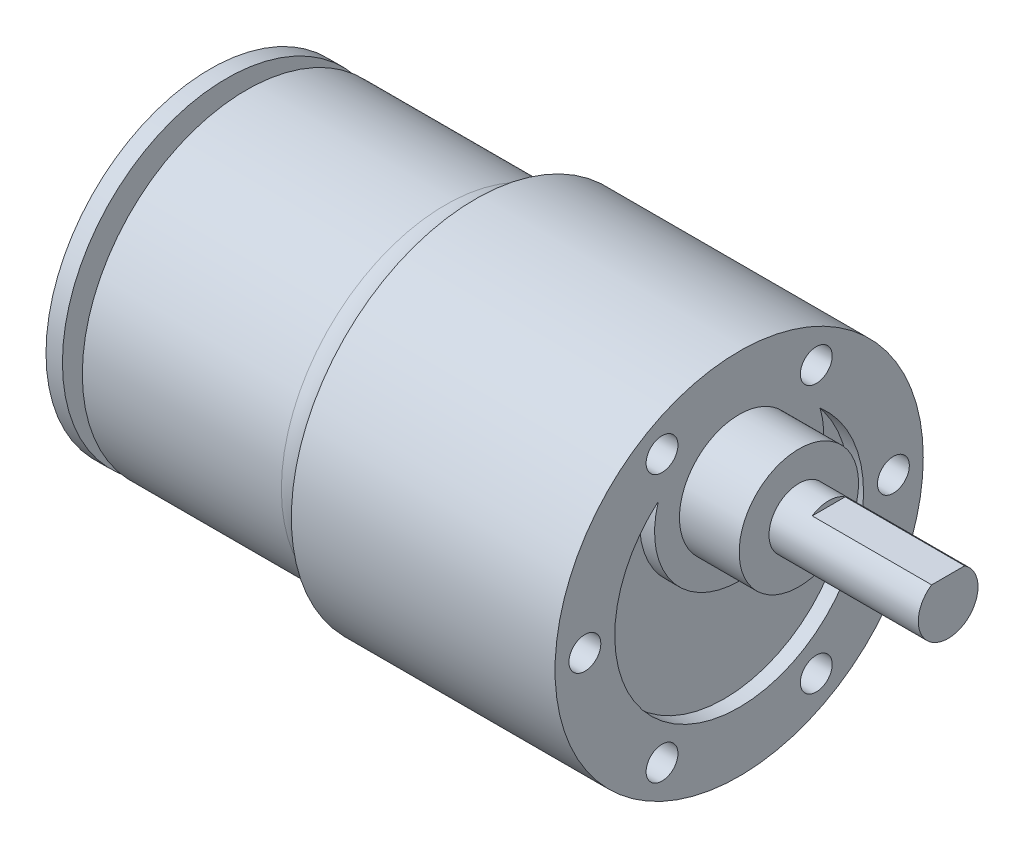
ISO-10303-21;
HEADER;
FILE_DESCRIPTION(('STEP AP214'),'2;1');
FILE_NAME('part.step','',(''),(''),'','','');
FILE_SCHEMA(('AUTOMOTIVE_DESIGN { 1 0 10303 214 1 1 1 1 }'));
ENDSEC;
DATA;
#1=APPLICATION_CONTEXT('core data for automotive mechanical design processes');
#2=APPLICATION_PROTOCOL_DEFINITION('international standard','automotive_design',2000,#1);
#3=PRODUCT_CONTEXT('',#1,'mechanical');
#4=PRODUCT('Part','Part','',(#3));
#5=PRODUCT_RELATED_PRODUCT_CATEGORY('part','',(#4));
#6=PRODUCT_DEFINITION_FORMATION('','',#4);
#7=PRODUCT_DEFINITION_CONTEXT('part definition',#1,'design');
#8=PRODUCT_DEFINITION('design','',#6,#7);
#9=PRODUCT_DEFINITION_SHAPE('','',#8);
#10=(LENGTH_UNIT() NAMED_UNIT(*) SI_UNIT(.MILLI.,.METRE.));
#11=(NAMED_UNIT(*) PLANE_ANGLE_UNIT() SI_UNIT($,.RADIAN.));
#12=(NAMED_UNIT(*) SI_UNIT($,.STERADIAN.) SOLID_ANGLE_UNIT());
#13=UNCERTAINTY_MEASURE_WITH_UNIT(LENGTH_MEASURE(1.E-05),#10,'distance_accuracy_value','');
#14=(GEOMETRIC_REPRESENTATION_CONTEXT(3) GLOBAL_UNCERTAINTY_ASSIGNED_CONTEXT((#13)) GLOBAL_UNIT_ASSIGNED_CONTEXT((#10,
#11,#12)) REPRESENTATION_CONTEXT('',''));
#15=CARTESIAN_POINT('',(0.,0.,0.));
#16=DIRECTION('',(0.,0.,1.));
#17=DIRECTION('',(1.,0.,0.));
#18=AXIS2_PLACEMENT_3D('',#15,#16,#17);
#19=CARTESIAN_POINT('',(49.5,0.,0.));
#20=DIRECTION('',(1.,0.,0.));
#21=DIRECTION('',(0.,0.,-1.));
#22=AXIS2_PLACEMENT_3D('',#19,#20,#21);
#23=PLANE('',#22);
#24=CARTESIAN_POINT('',(49.5,0.,15.5));
#25=DIRECTION('',(1.,0.,0.));
#26=DIRECTION('',(0.,0.,-1.));
#27=AXIS2_PLACEMENT_3D('',#24,#25,#26);
#28=CIRCLE('',#27,1.6);
#29=CARTESIAN_POINT('',(49.5,0.,13.9));
#30=VERTEX_POINT('',#29);
#31=EDGE_CURVE('E500',#30,#30,#28,.T.);
#32=ORIENTED_EDGE('',*,*,#31,.F.);
#33=EDGE_LOOP('',(#32));
#34=FACE_BOUND('',#33,.T.);
#35=CARTESIAN_POINT('',(49.5,-13.4233937586587,7.75000000000016));
#36=DIRECTION('',(1.,0.,0.));
#37=DIRECTION('',(0.,0.,-1.));
#38=AXIS2_PLACEMENT_3D('',#35,#36,#37);
#39=CIRCLE('',#38,1.6);
#40=CARTESIAN_POINT('',(49.5,-13.4233937586587,6.15000000000015));
#41=VERTEX_POINT('',#40);
#42=EDGE_CURVE('E528',#41,#41,#39,.T.);
#43=ORIENTED_EDGE('',*,*,#42,.F.);
#44=EDGE_LOOP('',(#43));
#45=FACE_BOUND('',#44,.T.);
#46=CARTESIAN_POINT('',(49.5,-13.4233937586589,-7.74999999999987));
#47=DIRECTION('',(1.,0.,0.));
#48=DIRECTION('',(0.,0.,-1.));
#49=AXIS2_PLACEMENT_3D('',#46,#47,#48);
#50=CIRCLE('',#49,1.6);
#51=CARTESIAN_POINT('',(49.5,-13.4233937586589,-9.34999999999988));
#52=VERTEX_POINT('',#51);
#53=EDGE_CURVE('E503',#52,#52,#50,.T.);
#54=ORIENTED_EDGE('',*,*,#53,.F.);
#55=EDGE_LOOP('',(#54));
#56=FACE_BOUND('',#55,.T.);
#57=CARTESIAN_POINT('',(49.5,-1.08235921504137E-13,-15.5));
#58=DIRECTION('',(1.,0.,0.));
#59=DIRECTION('',(0.,0.,-1.));
#60=AXIS2_PLACEMENT_3D('',#57,#58,#59);
#61=CIRCLE('',#60,1.6);
#62=CARTESIAN_POINT('',(49.5,-1.08235921504137E-13,-17.1));
#63=VERTEX_POINT('',#62);
#64=EDGE_CURVE('E510',#63,#63,#61,.T.);
#65=ORIENTED_EDGE('',*,*,#64,.F.);
#66=EDGE_LOOP('',(#65));
#67=FACE_BOUND('',#66,.T.);
#68=CARTESIAN_POINT('',(49.5,13.4233937586588,-7.75000000000006));
#69=DIRECTION('',(1.,0.,0.));
#70=DIRECTION('',(0.,0.,-1.));
#71=AXIS2_PLACEMENT_3D('',#68,#69,#70);
#72=CIRCLE('',#71,1.6);
#73=CARTESIAN_POINT('',(49.5,13.4233937586588,-9.35000000000006));
#74=VERTEX_POINT('',#73);
#75=EDGE_CURVE('E516',#74,#74,#72,.T.);
#76=ORIENTED_EDGE('',*,*,#75,.F.);
#77=EDGE_LOOP('',(#76));
#78=FACE_BOUND('',#77,.T.);
#79=CARTESIAN_POINT('',(49.5,13.4233937586588,7.74999999999997));
#80=DIRECTION('',(1.,0.,0.));
#81=DIRECTION('',(0.,0.,-1.));
#82=AXIS2_PLACEMENT_3D('',#79,#80,#81);
#83=CIRCLE('',#82,1.6);
#84=CARTESIAN_POINT('',(49.5,13.4233937586588,6.14999999999997));
#85=VERTEX_POINT('',#84);
#86=EDGE_CURVE('E522',#85,#85,#83,.T.);
#87=ORIENTED_EDGE('',*,*,#86,.F.);
#88=EDGE_LOOP('',(#87));
#89=FACE_BOUND('',#88,.T.);
#90=CARTESIAN_POINT('',(49.5,7.,0.));
#91=DIRECTION('',(1.,0.,0.));
#92=DIRECTION('',(0.,0.,-1.));
#93=AXIS2_PLACEMENT_3D('',#90,#91,#92);
#94=CIRCLE('',#93,6.);
#95=CARTESIAN_POINT('',(49.5,7.,-6.));
#96=VERTEX_POINT('',#95);
#97=EDGE_CURVE('E116',#96,#96,#94,.T.);
#98=ORIENTED_EDGE('',*,*,#97,.F.);
#99=EDGE_LOOP('',(#98));
#100=FACE_BOUND('',#99,.T.);
#101=CARTESIAN_POINT('',(49.5,0.,0.));
#102=DIRECTION('',(1.,0.,0.));
#103=DIRECTION('',(0.,0.,-1.));
#104=AXIS2_PLACEMENT_3D('',#101,#102,#103);
#105=CIRCLE('',#104,18.5);
#106=CARTESIAN_POINT('',(49.5,0.,-18.5));
#107=VERTEX_POINT('',#106);
#108=EDGE_CURVE('E124',#107,#107,#105,.T.);
#109=ORIENTED_EDGE('',*,*,#108,.T.);
#110=EDGE_LOOP('',(#109));
#111=FACE_BOUND('',#110,.T.);
#112=CARTESIAN_POINT('',(49.5,0.,0.));
#113=DIRECTION('',(1.,0.,0.));
#114=DIRECTION('',(0.,0.,-1.));
#115=AXIS2_PLACEMENT_3D('',#112,#113,#114);
#116=CIRCLE('',#115,12.5);
#117=CARTESIAN_POINT('',(49.5,9.5,8.12403840463596));
#118=VERTEX_POINT('',#117);
#119=CARTESIAN_POINT('',(49.5,9.5,-8.12403840463596));
#120=VERTEX_POINT('',#119);
#121=EDGE_CURVE('E107',#118,#120,#116,.T.);
#122=ORIENTED_EDGE('',*,*,#121,.F.);
#123=CARTESIAN_POINT('',(49.5,7.,0.));
#124=DIRECTION('',(1.,0.,0.));
#125=DIRECTION('',(0.,0.,-1.));
#126=AXIS2_PLACEMENT_3D('',#123,#124,#125);
#127=CIRCLE('',#126,8.5);
#128=EDGE_CURVE('E63',#118,#120,#127,.T.);
#129=ORIENTED_EDGE('',*,*,#128,.T.);
#130=EDGE_LOOP('',(#122,#129));
#131=FACE_BOUND('',#130,.T.);
#132=ADVANCED_FACE('F38',(#34,#45,#56,#67,#78,#89,#100,#111,#131),#23,.T.);
#133=CARTESIAN_POINT('',(23.,0.,0.));
#134=DIRECTION('',(-1.,0.,0.));
#135=DIRECTION('',(0.,0.,1.));
#136=AXIS2_PLACEMENT_3D('',#133,#134,#135);
#137=CYLINDRICAL_SURFACE('',#136,16.5);
#138=CARTESIAN_POINT('',(20.,0.,0.));
#139=DIRECTION('',(1.,0.,0.));
#140=DIRECTION('',(0.,0.,-1.));
#141=AXIS2_PLACEMENT_3D('',#138,#139,#140);
#142=CIRCLE('',#141,16.5);
#143=CARTESIAN_POINT('',(20.,0.,-16.5));
#144=VERTEX_POINT('',#143);
#145=EDGE_CURVE('E42',#144,#144,#142,.F.);
#146=ORIENTED_EDGE('',*,*,#145,.T.);
#147=EDGE_LOOP('',(#146));
#148=FACE_BOUND('',#147,.T.);
#149=CARTESIAN_POINT('',(0.,0.,0.));
#150=DIRECTION('',(1.,0.,0.));
#151=DIRECTION('',(0.,0.,-1.));
#152=AXIS2_PLACEMENT_3D('',#149,#150,#151);
#153=CIRCLE('',#152,16.5);
#154=CARTESIAN_POINT('',(0.,0.,-16.5));
#155=VERTEX_POINT('',#154);
#156=EDGE_CURVE('E127',#155,#155,#153,.T.);
#157=ORIENTED_EDGE('',*,*,#156,.T.);
#158=EDGE_LOOP('',(#157));
#159=FACE_BOUND('',#158,.T.);
#160=ADVANCED_FACE('F138',(#148,#159),#137,.T.);
#161=CARTESIAN_POINT('',(0.,0.,0.));
#162=DIRECTION('',(1.,0.,0.));
#163=DIRECTION('',(0.,0.,-1.));
#164=AXIS2_PLACEMENT_3D('',#161,#162,#163);
#165=PLANE('',#164);
#166=CARTESIAN_POINT('',(0.,0.,0.));
#167=DIRECTION('',(-1.,0.,0.));
#168=DIRECTION('',(0.,0.,1.));
#169=AXIS2_PLACEMENT_3D('',#166,#167,#168);
#170=CIRCLE('',#169,4.);
#171=CARTESIAN_POINT('',(0.,0.,4.));
#172=VERTEX_POINT('',#171);
#173=EDGE_CURVE('E11',#172,#172,#170,.T.);
#174=ORIENTED_EDGE('',*,*,#173,.F.);
#175=EDGE_LOOP('',(#174));
#176=FACE_BOUND('',#175,.T.);
#177=ORIENTED_EDGE('',*,*,#156,.F.);
#178=EDGE_LOOP('',(#177));
#179=FACE_BOUND('',#178,.T.);
#180=ADVANCED_FACE('F144',(#176,#179),#165,.F.);
#181=CARTESIAN_POINT('',(20.,0.,0.));
#182=DIRECTION('',(1.,0.,0.));
#183=DIRECTION('',(0.,0.,-1.));
#184=AXIS2_PLACEMENT_3D('',#181,#182,#183);
#185=TOROIDAL_SURFACE('',#184,13.5,3.);
#186=ORIENTED_EDGE('',*,*,#145,.F.);
#187=EDGE_LOOP('',(#186));
#188=FACE_BOUND('',#187,.T.);
#189=CARTESIAN_POINT('',(23.,0.,0.));
#190=DIRECTION('',(1.,0.,0.));
#191=DIRECTION('',(0.,0.,-1.));
#192=AXIS2_PLACEMENT_3D('',#189,#190,#191);
#193=CIRCLE('',#192,13.5);
#194=CARTESIAN_POINT('',(23.,0.,-13.5));
#195=VERTEX_POINT('',#194);
#196=EDGE_CURVE('E131',#195,#195,#193,.T.);
#197=ORIENTED_EDGE('',*,*,#196,.F.);
#198=EDGE_LOOP('',(#197));
#199=FACE_BOUND('',#198,.T.);
#200=ADVANCED_FACE('F40',(#188,#199),#185,.T.);
#201=CARTESIAN_POINT('',(49.5,0.,0.));
#202=DIRECTION('',(-1.,0.,0.));
#203=DIRECTION('',(0.,0.,1.));
#204=AXIS2_PLACEMENT_3D('',#201,#202,#203);
#205=CYLINDRICAL_SURFACE('',#204,18.5);
#206=ORIENTED_EDGE('',*,*,#108,.F.);
#207=EDGE_LOOP('',(#206));
#208=FACE_BOUND('',#207,.T.);
#209=CARTESIAN_POINT('',(23.,0.,0.));
#210=DIRECTION('',(1.,0.,0.));
#211=DIRECTION('',(0.,0.,-1.));
#212=AXIS2_PLACEMENT_3D('',#209,#210,#211);
#213=CIRCLE('',#212,18.5);
#214=CARTESIAN_POINT('',(23.,0.,-18.5));
#215=VERTEX_POINT('',#214);
#216=EDGE_CURVE('E121',#215,#215,#213,.T.);
#217=ORIENTED_EDGE('',*,*,#216,.T.);
#218=EDGE_LOOP('',(#217));
#219=FACE_BOUND('',#218,.T.);
#220=ADVANCED_FACE('F143',(#208,#219),#205,.T.);
#221=CARTESIAN_POINT('',(23.,0.,0.));
#222=DIRECTION('',(1.,0.,0.));
#223=DIRECTION('',(0.,0.,-1.));
#224=AXIS2_PLACEMENT_3D('',#221,#222,#223);
#225=PLANE('',#224);
#226=ORIENTED_EDGE('',*,*,#196,.T.);
#227=EDGE_LOOP('',(#226));
#228=FACE_BOUND('',#227,.T.);
#229=ORIENTED_EDGE('',*,*,#216,.F.);
#230=EDGE_LOOP('',(#229));
#231=FACE_BOUND('',#230,.T.);
#232=ADVANCED_FACE('F149',(#228,#231),#225,.F.);
#233=CARTESIAN_POINT('',(55.5,7.,0.));
#234=DIRECTION('',(-1.,0.,0.));
#235=DIRECTION('',(0.,0.,1.));
#236=AXIS2_PLACEMENT_3D('',#233,#234,#235);
#237=CYLINDRICAL_SURFACE('',#236,6.);
#238=CARTESIAN_POINT('',(55.5,7.,0.));
#239=DIRECTION('',(1.,0.,0.));
#240=DIRECTION('',(0.,0.,-1.));
#241=AXIS2_PLACEMENT_3D('',#238,#239,#240);
#242=CIRCLE('',#241,6.);
#243=CARTESIAN_POINT('',(55.5,7.,-6.));
#244=VERTEX_POINT('',#243);
#245=EDGE_CURVE('E118',#244,#244,#242,.T.);
#246=ORIENTED_EDGE('',*,*,#245,.F.);
#247=EDGE_LOOP('',(#246));
#248=FACE_BOUND('',#247,.T.);
#249=ORIENTED_EDGE('',*,*,#97,.T.);
#250=EDGE_LOOP('',(#249));
#251=FACE_BOUND('',#250,.T.);
#252=ADVANCED_FACE('F164',(#248,#251),#237,.T.);
#253=CARTESIAN_POINT('',(55.5,7.,0.));
#254=DIRECTION('',(1.,0.,0.));
#255=DIRECTION('',(0.,0.,-1.));
#256=AXIS2_PLACEMENT_3D('',#253,#254,#255);
#257=PLANE('',#256);
#258=CARTESIAN_POINT('',(55.5,7.,0.));
#259=DIRECTION('',(1.,0.,0.));
#260=DIRECTION('',(0.,0.,-1.));
#261=AXIS2_PLACEMENT_3D('',#258,#259,#260);
#262=CIRCLE('',#261,3.);
#263=CARTESIAN_POINT('',(55.5,7.,-3.));
#264=VERTEX_POINT('',#263);
#265=EDGE_CURVE('E47',#264,#264,#262,.T.);
#266=ORIENTED_EDGE('',*,*,#265,.F.);
#267=EDGE_LOOP('',(#266));
#268=FACE_BOUND('',#267,.T.);
#269=ORIENTED_EDGE('',*,*,#245,.T.);
#270=EDGE_LOOP('',(#269));
#271=FACE_BOUND('',#270,.T.);
#272=ADVANCED_FACE('F170',(#268,#271),#257,.T.);
#273=CARTESIAN_POINT('',(48.,7.,0.));
#274=DIRECTION('',(1.,0.,0.));
#275=DIRECTION('',(0.,0.,-1.));
#276=AXIS2_PLACEMENT_3D('',#273,#274,#275);
#277=CYLINDRICAL_SURFACE('',#276,8.5);
#278=ORIENTED_EDGE('',*,*,#128,.F.);
#279=DIRECTION('',(1.,0.,0.));
#280=VECTOR('',#279,1.);
#281=CARTESIAN_POINT('',(48.,9.5,8.12403840463596));
#282=LINE('',#281,#280);
#283=CARTESIAN_POINT('',(48.,9.5,8.12403840463596));
#284=VERTEX_POINT('',#283);
#285=EDGE_CURVE('E110',#284,#118,#282,.T.);
#286=ORIENTED_EDGE('',*,*,#285,.F.);
#287=CARTESIAN_POINT('',(48.,7.,0.));
#288=DIRECTION('',(1.,0.,0.));
#289=DIRECTION('',(0.,0.,-1.));
#290=AXIS2_PLACEMENT_3D('',#287,#288,#289);
#291=CIRCLE('',#290,8.5);
#292=CARTESIAN_POINT('',(48.,9.5,-8.12403840463596));
#293=VERTEX_POINT('',#292);
#294=EDGE_CURVE('E104',#284,#293,#291,.T.);
#295=ORIENTED_EDGE('',*,*,#294,.T.);
#296=DIRECTION('',(1.,0.,0.));
#297=VECTOR('',#296,1.);
#298=CARTESIAN_POINT('',(48.,9.5,-8.12403840463596));
#299=LINE('',#298,#297);
#300=EDGE_CURVE('E114',#293,#120,#299,.T.);
#301=ORIENTED_EDGE('',*,*,#300,.T.);
#302=EDGE_LOOP('',(#278,#286,#295,#301));
#303=FACE_BOUND('',#302,.T.);
#304=ADVANCED_FACE('F178',(#303),#277,.T.);
#305=CARTESIAN_POINT('',(48.,0.,0.));
#306=DIRECTION('',(1.,0.,0.));
#307=DIRECTION('',(0.,0.,-1.));
#308=AXIS2_PLACEMENT_3D('',#305,#306,#307);
#309=CYLINDRICAL_SURFACE('',#308,12.5);
#310=ORIENTED_EDGE('',*,*,#121,.T.);
#311=ORIENTED_EDGE('',*,*,#300,.F.);
#312=CARTESIAN_POINT('',(48.,0.,0.));
#313=DIRECTION('',(1.,0.,0.));
#314=DIRECTION('',(0.,0.,-1.));
#315=AXIS2_PLACEMENT_3D('',#312,#313,#314);
#316=CIRCLE('',#315,12.5);
#317=EDGE_CURVE('E106',#284,#293,#316,.T.);
#318=ORIENTED_EDGE('',*,*,#317,.F.);
#319=ORIENTED_EDGE('',*,*,#285,.T.);
#320=EDGE_LOOP('',(#310,#311,#318,#319));
#321=FACE_BOUND('',#320,.T.);
#322=ADVANCED_FACE('F190',(#321),#309,.F.);
#323=CARTESIAN_POINT('',(48.,0.,0.));
#324=DIRECTION('',(1.,0.,0.));
#325=DIRECTION('',(0.,0.,-1.));
#326=AXIS2_PLACEMENT_3D('',#323,#324,#325);
#327=PLANE('',#326);
#328=ORIENTED_EDGE('',*,*,#294,.F.);
#329=ORIENTED_EDGE('',*,*,#317,.T.);
#330=EDGE_LOOP('',(#328,#329));
#331=FACE_BOUND('',#330,.T.);
#332=ADVANCED_FACE('F194',(#331),#327,.T.);
#333=CARTESIAN_POINT('',(70.5,7.,0.));
#334=DIRECTION('',(-1.,0.,0.));
#335=DIRECTION('',(0.,0.,1.));
#336=AXIS2_PLACEMENT_3D('',#333,#334,#335);
#337=CYLINDRICAL_SURFACE('',#336,3.);
#338=CARTESIAN_POINT('',(70.5,7.,0.));
#339=DIRECTION('',(1.,0.,0.));
#340=DIRECTION('',(0.,0.,-1.));
#341=AXIS2_PLACEMENT_3D('',#338,#339,#340);
#342=CIRCLE('',#341,3.);
#343=CARTESIAN_POINT('',(70.5,9.5,1.6583123951777));
#344=VERTEX_POINT('',#343);
#345=CARTESIAN_POINT('',(70.5,9.5,-1.6583123951777));
#346=VERTEX_POINT('',#345);
#347=EDGE_CURVE('E96',#344,#346,#342,.T.);
#348=ORIENTED_EDGE('',*,*,#347,.F.);
#349=DIRECTION('',(1.,0.,0.));
#350=VECTOR('',#349,1.);
#351=CARTESIAN_POINT('',(58.5,9.5,1.6583123951777));
#352=LINE('',#351,#350);
#353=CARTESIAN_POINT('',(58.5,9.5,1.6583123951777));
#354=VERTEX_POINT('',#353);
#355=EDGE_CURVE('E55',#354,#344,#352,.T.);
#356=ORIENTED_EDGE('',*,*,#355,.F.);
#357=CARTESIAN_POINT('',(58.5,7.,0.));
#358=DIRECTION('',(1.,0.,0.));
#359=DIRECTION('',(0.,0.,-1.));
#360=AXIS2_PLACEMENT_3D('',#357,#358,#359);
#361=CIRCLE('',#360,3.);
#362=CARTESIAN_POINT('',(58.5,9.5,-1.6583123951777));
#363=VERTEX_POINT('',#362);
#364=EDGE_CURVE('E82',#363,#354,#361,.T.);
#365=ORIENTED_EDGE('',*,*,#364,.F.);
#366=DIRECTION('',(1.,0.,0.));
#367=VECTOR('',#366,1.);
#368=CARTESIAN_POINT('',(58.5,9.5,-1.6583123951777));
#369=LINE('',#368,#367);
#370=EDGE_CURVE('E90',#363,#346,#369,.T.);
#371=ORIENTED_EDGE('',*,*,#370,.T.);
#372=EDGE_LOOP('',(#348,#356,#365,#371));
#373=FACE_BOUND('',#372,.T.);
#374=ORIENTED_EDGE('',*,*,#265,.T.);
#375=EDGE_LOOP('',(#374));
#376=FACE_BOUND('',#375,.T.);
#377=ADVANCED_FACE('F93',(#373,#376),#337,.T.);
#378=CARTESIAN_POINT('',(70.5,7.,0.));
#379=DIRECTION('',(1.,0.,0.));
#380=DIRECTION('',(0.,0.,-1.));
#381=AXIS2_PLACEMENT_3D('',#378,#379,#380);
#382=PLANE('',#381);
#383=DIRECTION('',(0.,0.,-1.));
#384=VECTOR('',#383,1.);
#385=CARTESIAN_POINT('',(70.5,9.5,1.6583123951777));
#386=LINE('',#385,#384);
#387=EDGE_CURVE('E87',#344,#346,#386,.T.);
#388=ORIENTED_EDGE('',*,*,#387,.F.);
#389=ORIENTED_EDGE('',*,*,#347,.T.);
#390=EDGE_LOOP('',(#388,#389));
#391=FACE_BOUND('',#390,.T.);
#392=ADVANCED_FACE('F201',(#391),#382,.T.);
#393=CARTESIAN_POINT('',(58.5,9.5,1.6583123951777));
#394=DIRECTION('',(0.,-1.,0.));
#395=DIRECTION('',(0.,0.,-1.));
#396=AXIS2_PLACEMENT_3D('',#393,#394,#395);
#397=PLANE('',#396);
#398=ORIENTED_EDGE('',*,*,#387,.T.);
#399=ORIENTED_EDGE('',*,*,#370,.F.);
#400=DIRECTION('',(0.,0.,-1.));
#401=VECTOR('',#400,1.);
#402=CARTESIAN_POINT('',(58.5,9.5,1.6583123951777));
#403=LINE('',#402,#401);
#404=EDGE_CURVE('E84',#354,#363,#403,.T.);
#405=ORIENTED_EDGE('',*,*,#404,.F.);
#406=ORIENTED_EDGE('',*,*,#355,.T.);
#407=EDGE_LOOP('',(#398,#399,#405,#406));
#408=FACE_BOUND('',#407,.T.);
#409=ADVANCED_FACE('F89',(#408),#397,.F.);
#410=CARTESIAN_POINT('',(58.5,7.,0.));
#411=DIRECTION('',(1.,0.,0.));
#412=DIRECTION('',(0.,0.,-1.));
#413=AXIS2_PLACEMENT_3D('',#410,#411,#412);
#414=PLANE('',#413);
#415=ORIENTED_EDGE('',*,*,#364,.T.);
#416=ORIENTED_EDGE('',*,*,#404,.T.);
#417=EDGE_LOOP('',(#415,#416));
#418=FACE_BOUND('',#417,.T.);
#419=ADVANCED_FACE('F83',(#418),#414,.T.);
#420=CARTESIAN_POINT('',(46.5,13.4233937586588,7.74999999999997));
#421=DIRECTION('',(1.,0.,0.));
#422=DIRECTION('',(0.,0.,-1.));
#423=AXIS2_PLACEMENT_3D('',#420,#421,#422);
#424=CYLINDRICAL_SURFACE('',#423,1.6);
#425=CARTESIAN_POINT('',(46.5,13.4233937586588,7.74999999999997));
#426=DIRECTION('',(1.,0.,0.));
#427=DIRECTION('',(0.,0.,-1.));
#428=AXIS2_PLACEMENT_3D('',#425,#426,#427);
#429=CIRCLE('',#428,1.6);
#430=CARTESIAN_POINT('',(46.5,13.4233937586588,6.14999999999997));
#431=VERTEX_POINT('',#430);
#432=EDGE_CURVE('E525',#431,#431,#429,.T.);
#433=ORIENTED_EDGE('',*,*,#432,.F.);
#434=EDGE_LOOP('',(#433));
#435=FACE_BOUND('',#434,.T.);
#436=ORIENTED_EDGE('',*,*,#86,.T.);
#437=EDGE_LOOP('',(#436));
#438=FACE_BOUND('',#437,.T.);
#439=ADVANCED_FACE('F235',(#435,#438),#424,.F.);
#440=CARTESIAN_POINT('',(46.5,13.4233937586588,7.74999999999997));
#441=DIRECTION('',(1.,0.,0.));
#442=DIRECTION('',(0.,0.,-1.));
#443=AXIS2_PLACEMENT_3D('',#440,#441,#442);
#444=PLANE('',#443);
#445=ORIENTED_EDGE('',*,*,#432,.T.);
#446=EDGE_LOOP('',(#445));
#447=FACE_BOUND('',#446,.T.);
#448=ADVANCED_FACE('F242',(#447),#444,.T.);
#449=CARTESIAN_POINT('',(46.5,13.4233937586588,-7.75000000000006));
#450=DIRECTION('',(1.,0.,0.));
#451=DIRECTION('',(0.,0.,-1.));
#452=AXIS2_PLACEMENT_3D('',#449,#450,#451);
#453=CYLINDRICAL_SURFACE('',#452,1.6);
#454=CARTESIAN_POINT('',(46.5,13.4233937586588,-7.75000000000006));
#455=DIRECTION('',(1.,0.,0.));
#456=DIRECTION('',(0.,0.,-1.));
#457=AXIS2_PLACEMENT_3D('',#454,#455,#456);
#458=CIRCLE('',#457,1.6);
#459=CARTESIAN_POINT('',(46.5,13.4233937586588,-9.35000000000006));
#460=VERTEX_POINT('',#459);
#461=EDGE_CURVE('E519',#460,#460,#458,.T.);
#462=ORIENTED_EDGE('',*,*,#461,.F.);
#463=EDGE_LOOP('',(#462));
#464=FACE_BOUND('',#463,.T.);
#465=ORIENTED_EDGE('',*,*,#75,.T.);
#466=EDGE_LOOP('',(#465));
#467=FACE_BOUND('',#466,.T.);
#468=ADVANCED_FACE('F250',(#464,#467),#453,.F.);
#469=CARTESIAN_POINT('',(46.5,13.4233937586588,-7.75000000000006));
#470=DIRECTION('',(1.,0.,0.));
#471=DIRECTION('',(0.,0.,-1.));
#472=AXIS2_PLACEMENT_3D('',#469,#470,#471);
#473=PLANE('',#472);
#474=ORIENTED_EDGE('',*,*,#461,.T.);
#475=EDGE_LOOP('',(#474));
#476=FACE_BOUND('',#475,.T.);
#477=ADVANCED_FACE('F258',(#476),#473,.T.);
#478=CARTESIAN_POINT('',(46.5,-1.08235921504137E-13,-15.5));
#479=DIRECTION('',(1.,0.,0.));
#480=DIRECTION('',(0.,0.,-1.));
#481=AXIS2_PLACEMENT_3D('',#478,#479,#480);
#482=CYLINDRICAL_SURFACE('',#481,1.6);
#483=CARTESIAN_POINT('',(46.5,-1.08235921504137E-13,-15.5));
#484=DIRECTION('',(1.,0.,0.));
#485=DIRECTION('',(0.,0.,-1.));
#486=AXIS2_PLACEMENT_3D('',#483,#484,#485);
#487=CIRCLE('',#486,1.6);
#488=CARTESIAN_POINT('',(46.5,-1.08235921504137E-13,-17.1));
#489=VERTEX_POINT('',#488);
#490=EDGE_CURVE('E513',#489,#489,#487,.T.);
#491=ORIENTED_EDGE('',*,*,#490,.F.);
#492=EDGE_LOOP('',(#491));
#493=FACE_BOUND('',#492,.T.);
#494=ORIENTED_EDGE('',*,*,#64,.T.);
#495=EDGE_LOOP('',(#494));
#496=FACE_BOUND('',#495,.T.);
#497=ADVANCED_FACE('F266',(#493,#496),#482,.F.);
#498=CARTESIAN_POINT('',(46.5,-1.08235921504137E-13,-15.5));
#499=DIRECTION('',(1.,0.,0.));
#500=DIRECTION('',(0.,0.,-1.));
#501=AXIS2_PLACEMENT_3D('',#498,#499,#500);
#502=PLANE('',#501);
#503=ORIENTED_EDGE('',*,*,#490,.T.);
#504=EDGE_LOOP('',(#503));
#505=FACE_BOUND('',#504,.T.);
#506=ADVANCED_FACE('F274',(#505),#502,.T.);
#507=CARTESIAN_POINT('',(46.5,-13.4233937586589,-7.74999999999987));
#508=DIRECTION('',(1.,0.,0.));
#509=DIRECTION('',(0.,0.,-1.));
#510=AXIS2_PLACEMENT_3D('',#507,#508,#509);
#511=CYLINDRICAL_SURFACE('',#510,1.6);
#512=CARTESIAN_POINT('',(46.5,-13.4233937586589,-7.74999999999987));
#513=DIRECTION('',(1.,0.,0.));
#514=DIRECTION('',(0.,0.,-1.));
#515=AXIS2_PLACEMENT_3D('',#512,#513,#514);
#516=CIRCLE('',#515,1.6);
#517=CARTESIAN_POINT('',(46.5,-13.4233937586589,-9.34999999999988));
#518=VERTEX_POINT('',#517);
#519=EDGE_CURVE('E506',#518,#518,#516,.T.);
#520=ORIENTED_EDGE('',*,*,#519,.F.);
#521=EDGE_LOOP('',(#520));
#522=FACE_BOUND('',#521,.T.);
#523=ORIENTED_EDGE('',*,*,#53,.T.);
#524=EDGE_LOOP('',(#523));
#525=FACE_BOUND('',#524,.T.);
#526=ADVANCED_FACE('F282',(#522,#525),#511,.F.);
#527=CARTESIAN_POINT('',(46.5,-13.4233937586589,-7.74999999999987));
#528=DIRECTION('',(1.,0.,0.));
#529=DIRECTION('',(0.,0.,-1.));
#530=AXIS2_PLACEMENT_3D('',#527,#528,#529);
#531=PLANE('',#530);
#532=ORIENTED_EDGE('',*,*,#519,.T.);
#533=EDGE_LOOP('',(#532));
#534=FACE_BOUND('',#533,.T.);
#535=ADVANCED_FACE('F290',(#534),#531,.T.);
#536=CARTESIAN_POINT('',(46.5,-13.4233937586587,7.75000000000016));
#537=DIRECTION('',(1.,0.,0.));
#538=DIRECTION('',(0.,0.,-1.));
#539=AXIS2_PLACEMENT_3D('',#536,#537,#538);
#540=CYLINDRICAL_SURFACE('',#539,1.6);
#541=CARTESIAN_POINT('',(46.5,-13.4233937586587,7.75000000000016));
#542=DIRECTION('',(1.,0.,0.));
#543=DIRECTION('',(0.,0.,-1.));
#544=AXIS2_PLACEMENT_3D('',#541,#542,#543);
#545=CIRCLE('',#544,1.6);
#546=CARTESIAN_POINT('',(46.5,-13.4233937586587,6.15000000000015));
#547=VERTEX_POINT('',#546);
#548=EDGE_CURVE('E507',#547,#547,#545,.T.);
#549=ORIENTED_EDGE('',*,*,#548,.F.);
#550=EDGE_LOOP('',(#549));
#551=FACE_BOUND('',#550,.T.);
#552=ORIENTED_EDGE('',*,*,#42,.T.);
#553=EDGE_LOOP('',(#552));
#554=FACE_BOUND('',#553,.T.);
#555=ADVANCED_FACE('F298',(#551,#554),#540,.F.);
#556=CARTESIAN_POINT('',(46.5,-13.4233937586587,7.75000000000016));
#557=DIRECTION('',(1.,0.,0.));
#558=DIRECTION('',(0.,0.,-1.));
#559=AXIS2_PLACEMENT_3D('',#556,#557,#558);
#560=PLANE('',#559);
#561=ORIENTED_EDGE('',*,*,#548,.T.);
#562=EDGE_LOOP('',(#561));
#563=FACE_BOUND('',#562,.T.);
#564=ADVANCED_FACE('F306',(#563),#560,.T.);
#565=CARTESIAN_POINT('',(46.5,0.,15.5));
#566=DIRECTION('',(1.,0.,0.));
#567=DIRECTION('',(0.,0.,-1.));
#568=AXIS2_PLACEMENT_3D('',#565,#566,#567);
#569=CYLINDRICAL_SURFACE('',#568,1.6);
#570=CARTESIAN_POINT('',(46.5,0.,15.5));
#571=DIRECTION('',(1.,0.,0.));
#572=DIRECTION('',(0.,0.,-1.));
#573=AXIS2_PLACEMENT_3D('',#570,#571,#572);
#574=CIRCLE('',#573,1.6);
#575=CARTESIAN_POINT('',(46.5,0.,13.9));
#576=VERTEX_POINT('',#575);
#577=EDGE_CURVE('E498',#576,#576,#574,.T.);
#578=ORIENTED_EDGE('',*,*,#577,.F.);
#579=EDGE_LOOP('',(#578));
#580=FACE_BOUND('',#579,.T.);
#581=ORIENTED_EDGE('',*,*,#31,.T.);
#582=EDGE_LOOP('',(#581));
#583=FACE_BOUND('',#582,.T.);
#584=ADVANCED_FACE('F314',(#580,#583),#569,.F.);
#585=CARTESIAN_POINT('',(46.5,0.,15.5));
#586=DIRECTION('',(1.,0.,0.));
#587=DIRECTION('',(0.,0.,-1.));
#588=AXIS2_PLACEMENT_3D('',#585,#586,#587);
#589=PLANE('',#588);
#590=ORIENTED_EDGE('',*,*,#577,.T.);
#591=EDGE_LOOP('',(#590));
#592=FACE_BOUND('',#591,.T.);
#593=ADVANCED_FACE('F322',(#592),#589,.T.);
#594=CARTESIAN_POINT('',(-2.,0.,0.));
#595=DIRECTION('',(1.,0.,0.));
#596=DIRECTION('',(0.,0.,-1.));
#597=AXIS2_PLACEMENT_3D('',#594,#595,#596);
#598=CYLINDRICAL_SURFACE('',#597,4.);
#599=CARTESIAN_POINT('',(-2.,0.,0.));
#600=DIRECTION('',(-1.,0.,0.));
#601=DIRECTION('',(0.,0.,1.));
#602=AXIS2_PLACEMENT_3D('',#599,#600,#601);
#603=CIRCLE('',#602,4.);
#604=CARTESIAN_POINT('',(-2.,0.,4.));
#605=VERTEX_POINT('',#604);
#606=EDGE_CURVE('E531',#605,#605,#603,.T.);
#607=ORIENTED_EDGE('',*,*,#606,.F.);
#608=EDGE_LOOP('',(#607));
#609=FACE_BOUND('',#608,.T.);
#610=ORIENTED_EDGE('',*,*,#173,.T.);
#611=EDGE_LOOP('',(#610));
#612=FACE_BOUND('',#611,.T.);
#613=ADVANCED_FACE('F330',(#609,#612),#598,.T.);
#614=CARTESIAN_POINT('',(-3.65,0.,0.));
#615=DIRECTION('',(1.,0.,0.));
#616=DIRECTION('',(0.,0.,-1.));
#617=AXIS2_PLACEMENT_3D('',#614,#615,#616);
#618=CYLINDRICAL_SURFACE('',#617,16.5);
#619=CARTESIAN_POINT('',(-3.65,0.,0.));
#620=DIRECTION('',(-1.,0.,0.));
#621=DIRECTION('',(0.,0.,1.));
#622=AXIS2_PLACEMENT_3D('',#619,#620,#621);
#623=CIRCLE('',#622,16.5);
#624=CARTESIAN_POINT('',(-3.65,0.,16.5));
#625=VERTEX_POINT('',#624);
#626=EDGE_CURVE('E538',#625,#625,#623,.T.);
#627=ORIENTED_EDGE('',*,*,#626,.F.);
#628=EDGE_LOOP('',(#627));
#629=FACE_BOUND('',#628,.T.);
#630=CARTESIAN_POINT('',(-2.,0.,0.));
#631=DIRECTION('',(-1.,0.,0.));
#632=DIRECTION('',(0.,0.,1.));
#633=AXIS2_PLACEMENT_3D('',#630,#631,#632);
#634=CIRCLE('',#633,16.5);
#635=CARTESIAN_POINT('',(-2.,0.,16.5));
#636=VERTEX_POINT('',#635);
#637=EDGE_CURVE('E539',#636,#636,#634,.T.);
#638=ORIENTED_EDGE('',*,*,#637,.T.);
#639=EDGE_LOOP('',(#638));
#640=FACE_BOUND('',#639,.T.);
#641=ADVANCED_FACE('F339',(#629,#640),#618,.T.);
#642=CARTESIAN_POINT('',(-3.65,0.,0.));
#643=DIRECTION('',(-1.,0.,0.));
#644=DIRECTION('',(0.,0.,1.));
#645=AXIS2_PLACEMENT_3D('',#642,#643,#644);
#646=PLANE('',#645);
#647=CARTESIAN_POINT('',(-3.65,0.,0.));
#648=DIRECTION('',(-1.,0.,0.));
#649=DIRECTION('',(0.,0.,1.));
#650=AXIS2_PLACEMENT_3D('',#647,#648,#649);
#651=CIRCLE('',#650,1.);
#652=CARTESIAN_POINT('',(-3.65,0.,1.));
#653=VERTEX_POINT('',#652);
#654=EDGE_CURVE('E545',#653,#653,#651,.T.);
#655=ORIENTED_EDGE('',*,*,#654,.F.);
#656=EDGE_LOOP('',(#655));
#657=FACE_BOUND('',#656,.T.);
#658=ORIENTED_EDGE('',*,*,#626,.T.);
#659=EDGE_LOOP('',(#658));
#660=FACE_BOUND('',#659,.T.);
#661=ADVANCED_FACE('F347',(#657,#660),#646,.T.);
#662=CARTESIAN_POINT('',(-2.,0.,0.));
#663=DIRECTION('',(-1.,0.,0.));
#664=DIRECTION('',(0.,0.,1.));
#665=AXIS2_PLACEMENT_3D('',#662,#663,#664);
#666=PLANE('',#665);
#667=ORIENTED_EDGE('',*,*,#606,.T.);
#668=EDGE_LOOP('',(#667));
#669=FACE_BOUND('',#668,.T.);
#670=ORIENTED_EDGE('',*,*,#637,.F.);
#671=EDGE_LOOP('',(#670));
#672=FACE_BOUND('',#671,.T.);
#673=ADVANCED_FACE('F356',(#669,#672),#666,.F.);
#674=CARTESIAN_POINT('',(-5.3,0.,0.));
#675=DIRECTION('',(1.,0.,0.));
#676=DIRECTION('',(0.,0.,-1.));
#677=AXIS2_PLACEMENT_3D('',#674,#675,#676);
#678=CYLINDRICAL_SURFACE('',#677,1.);
#679=CARTESIAN_POINT('',(-5.3,0.,0.));
#680=DIRECTION('',(-1.,0.,0.));
#681=DIRECTION('',(0.,0.,1.));
#682=AXIS2_PLACEMENT_3D('',#679,#680,#681);
#683=CIRCLE('',#682,1.);
#684=CARTESIAN_POINT('',(-5.3,0.,1.));
#685=VERTEX_POINT('',#684);
#686=EDGE_CURVE('E542',#685,#685,#683,.T.);
#687=ORIENTED_EDGE('',*,*,#686,.F.);
#688=EDGE_LOOP('',(#687));
#689=FACE_BOUND('',#688,.T.);
#690=ORIENTED_EDGE('',*,*,#654,.T.);
#691=EDGE_LOOP('',(#690));
#692=FACE_BOUND('',#691,.T.);
#693=ADVANCED_FACE('F364',(#689,#692),#678,.T.);
#694=CARTESIAN_POINT('',(-10.3,0.,0.));
#695=DIRECTION('',(1.,0.,0.));
#696=DIRECTION('',(0.,0.,-1.));
#697=AXIS2_PLACEMENT_3D('',#694,#695,#696);
#698=CYLINDRICAL_SURFACE('',#697,7.);
#699=CARTESIAN_POINT('',(-10.3,0.,0.));
#700=DIRECTION('',(-1.,0.,0.));
#701=DIRECTION('',(0.,0.,1.));
#702=AXIS2_PLACEMENT_3D('',#699,#700,#701);
#703=CIRCLE('',#702,7.);
#704=CARTESIAN_POINT('',(-10.3,0.,7.));
#705=VERTEX_POINT('',#704);
#706=EDGE_CURVE('E548',#705,#705,#703,.T.);
#707=ORIENTED_EDGE('',*,*,#706,.F.);
#708=EDGE_LOOP('',(#707));
#709=FACE_BOUND('',#708,.T.);
#710=CARTESIAN_POINT('',(-5.3,0.,0.));
#711=DIRECTION('',(-1.,0.,0.));
#712=DIRECTION('',(0.,0.,1.));
#713=AXIS2_PLACEMENT_3D('',#710,#711,#712);
#714=CIRCLE('',#713,7.);
#715=CARTESIAN_POINT('',(-5.3,0.,7.));
#716=VERTEX_POINT('',#715);
#717=EDGE_CURVE('E551',#716,#716,#714,.T.);
#718=ORIENTED_EDGE('',*,*,#717,.T.);
#719=EDGE_LOOP('',(#718));
#720=FACE_BOUND('',#719,.T.);
#721=ADVANCED_FACE('F371',(#709,#720),#698,.T.);
#722=CARTESIAN_POINT('',(-10.3,0.,0.));
#723=DIRECTION('',(-1.,0.,0.));
#724=DIRECTION('',(0.,0.,1.));
#725=AXIS2_PLACEMENT_3D('',#722,#723,#724);
#726=PLANE('',#725);
#727=ORIENTED_EDGE('',*,*,#706,.T.);
#728=EDGE_LOOP('',(#727));
#729=FACE_BOUND('',#728,.T.);
#730=ADVANCED_FACE('F379',(#729),#726,.T.);
#731=CARTESIAN_POINT('',(-5.3,0.,0.));
#732=DIRECTION('',(-1.,0.,0.));
#733=DIRECTION('',(0.,0.,1.));
#734=AXIS2_PLACEMENT_3D('',#731,#732,#733);
#735=PLANE('',#734);
#736=ORIENTED_EDGE('',*,*,#686,.T.);
#737=EDGE_LOOP('',(#736));
#738=FACE_BOUND('',#737,.T.);
#739=ORIENTED_EDGE('',*,*,#717,.F.);
#740=EDGE_LOOP('',(#739));
#741=FACE_BOUND('',#740,.T.);
#742=ADVANCED_FACE('F387',(#738,#741),#735,.F.);
#743=CLOSED_SHELL('',(#132,#160,#180,#200,#220,#232,#252,#272,#304,#322,#332,#377,#392,#409,
#419,#439,#448,#468,#477,#497,#506,#526,#535,#555,#564,#584,#593,#613,#641,#661,#673,#693,#721,
#730,#742));
#744=MANIFOLD_SOLID_BREP('B2',#743);
#745=ADVANCED_BREP_SHAPE_REPRESENTATION('',(#18,#744),#14);
#746=SHAPE_DEFINITION_REPRESENTATION(#9,#745);
ENDSEC;
END-ISO-10303-21;
